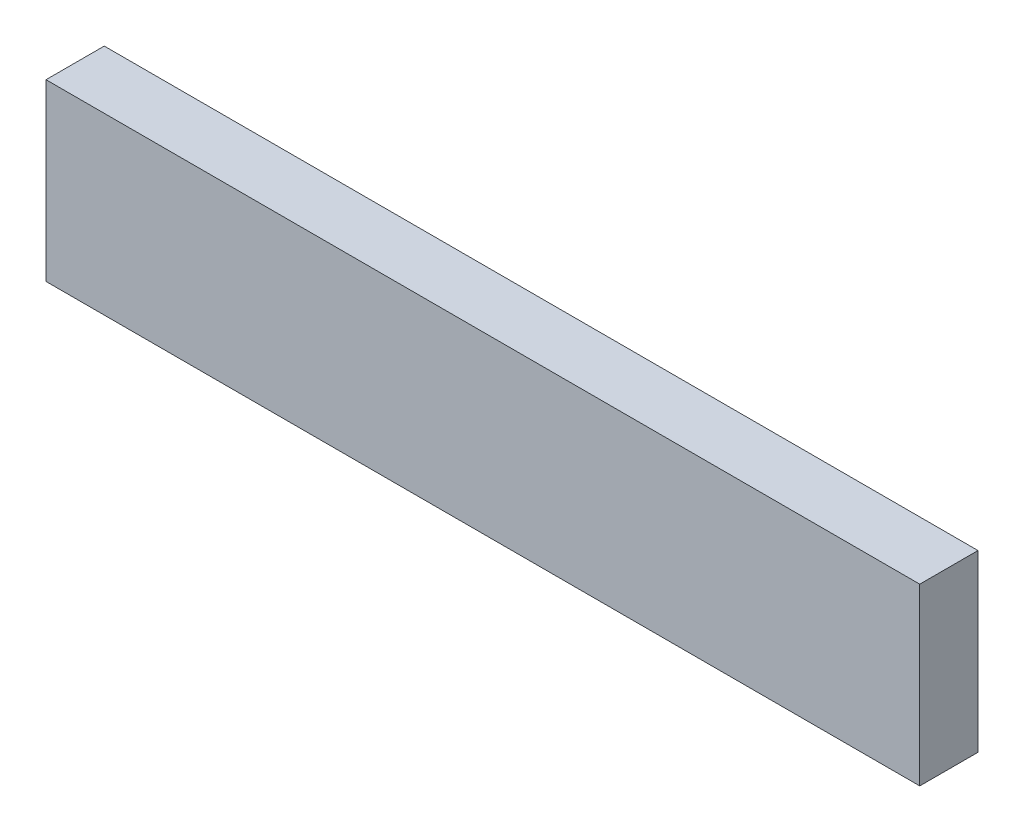
ISO-10303-21;
HEADER;
FILE_DESCRIPTION(('STEP AP214'),'2;1');
FILE_NAME('part.step','',(''),(''),'','','');
FILE_SCHEMA(('AUTOMOTIVE_DESIGN { 1 0 10303 214 1 1 1 1 }'));
ENDSEC;
DATA;
#1=APPLICATION_CONTEXT('core data for automotive mechanical design processes');
#2=APPLICATION_PROTOCOL_DEFINITION('international standard','automotive_design',2000,#1);
#3=PRODUCT_CONTEXT('',#1,'mechanical');
#4=PRODUCT('Part','Part','',(#3));
#5=PRODUCT_RELATED_PRODUCT_CATEGORY('part','',(#4));
#6=PRODUCT_DEFINITION_FORMATION('','',#4);
#7=PRODUCT_DEFINITION_CONTEXT('part definition',#1,'design');
#8=PRODUCT_DEFINITION('design','',#6,#7);
#9=PRODUCT_DEFINITION_SHAPE('','',#8);
#10=(LENGTH_UNIT() NAMED_UNIT(*) SI_UNIT(.MILLI.,.METRE.));
#11=(NAMED_UNIT(*) PLANE_ANGLE_UNIT() SI_UNIT($,.RADIAN.));
#12=(NAMED_UNIT(*) SI_UNIT($,.STERADIAN.) SOLID_ANGLE_UNIT());
#13=UNCERTAINTY_MEASURE_WITH_UNIT(LENGTH_MEASURE(1.E-05),#10,'distance_accuracy_value','');
#14=(GEOMETRIC_REPRESENTATION_CONTEXT(3) GLOBAL_UNCERTAINTY_ASSIGNED_CONTEXT((#13)) GLOBAL_UNIT_ASSIGNED_CONTEXT((#10,
#11,#12)) REPRESENTATION_CONTEXT('',''));
#15=CARTESIAN_POINT('',(0.,0.,0.));
#16=DIRECTION('',(0.,0.,1.));
#17=DIRECTION('',(1.,0.,0.));
#18=AXIS2_PLACEMENT_3D('',#15,#16,#17);
#19=CARTESIAN_POINT('',(22.5,4.5,3.));
#20=DIRECTION('',(-1.,0.,0.));
#21=DIRECTION('',(0.,0.,1.));
#22=AXIS2_PLACEMENT_3D('',#19,#20,#21);
#23=PLANE('',#22);
#24=DIRECTION('',(0.,1.,0.));
#25=VECTOR('',#24,1.);
#26=CARTESIAN_POINT('',(22.5,4.5,0.));
#27=LINE('',#26,#25);
#28=CARTESIAN_POINT('',(22.5,-4.5,0.));
#29=VERTEX_POINT('',#28);
#30=CARTESIAN_POINT('',(22.5,4.5,0.));
#31=VERTEX_POINT('',#30);
#32=EDGE_CURVE('E96',#29,#31,#27,.T.);
#33=ORIENTED_EDGE('',*,*,#32,.T.);
#34=DIRECTION('',(0.,0.,-1.));
#35=VECTOR('',#34,1.);
#36=CARTESIAN_POINT('',(22.5,4.5,3.));
#37=LINE('',#36,#35);
#38=CARTESIAN_POINT('',(22.5,4.5,3.));
#39=VERTEX_POINT('',#38);
#40=EDGE_CURVE('E11',#39,#31,#37,.T.);
#41=ORIENTED_EDGE('',*,*,#40,.F.);
#42=DIRECTION('',(0.,1.,0.));
#43=VECTOR('',#42,1.);
#44=CARTESIAN_POINT('',(22.5,4.5,3.));
#45=LINE('',#44,#43);
#46=CARTESIAN_POINT('',(22.5,-4.5,3.));
#47=VERTEX_POINT('',#46);
#48=EDGE_CURVE('E84',#47,#39,#45,.T.);
#49=ORIENTED_EDGE('',*,*,#48,.F.);
#50=DIRECTION('',(0.,0.,-1.));
#51=VECTOR('',#50,1.);
#52=CARTESIAN_POINT('',(22.5,-4.5,3.));
#53=LINE('',#52,#51);
#54=EDGE_CURVE('E92',#47,#29,#53,.T.);
#55=ORIENTED_EDGE('',*,*,#54,.T.);
#56=EDGE_LOOP('',(#33,#41,#49,#55));
#57=FACE_BOUND('',#56,.T.);
#58=ADVANCED_FACE('F33',(#57),#23,.F.);
#59=CARTESIAN_POINT('',(-22.5,4.5,3.));
#60=DIRECTION('',(0.,-1.,0.));
#61=DIRECTION('',(0.,0.,-1.));
#62=AXIS2_PLACEMENT_3D('',#59,#60,#61);
#63=PLANE('',#62);
#64=DIRECTION('',(-1.,0.,0.));
#65=VECTOR('',#64,1.);
#66=CARTESIAN_POINT('',(-22.5,4.5,0.));
#67=LINE('',#66,#65);
#68=CARTESIAN_POINT('',(-22.5,4.5,0.));
#69=VERTEX_POINT('',#68);
#70=EDGE_CURVE('E88',#31,#69,#67,.T.);
#71=ORIENTED_EDGE('',*,*,#70,.T.);
#72=DIRECTION('',(0.,0.,-1.));
#73=VECTOR('',#72,1.);
#74=CARTESIAN_POINT('',(-22.5,4.5,3.));
#75=LINE('',#74,#73);
#76=CARTESIAN_POINT('',(-22.5,4.5,3.));
#77=VERTEX_POINT('',#76);
#78=EDGE_CURVE('E41',#77,#69,#75,.T.);
#79=ORIENTED_EDGE('',*,*,#78,.F.);
#80=DIRECTION('',(-1.,0.,0.));
#81=VECTOR('',#80,1.);
#82=CARTESIAN_POINT('',(-22.5,4.5,3.));
#83=LINE('',#82,#81);
#84=EDGE_CURVE('E79',#39,#77,#83,.T.);
#85=ORIENTED_EDGE('',*,*,#84,.F.);
#86=ORIENTED_EDGE('',*,*,#40,.T.);
#87=EDGE_LOOP('',(#71,#79,#85,#86));
#88=FACE_BOUND('',#87,.T.);
#89=ADVANCED_FACE('F87',(#88),#63,.F.);
#90=CARTESIAN_POINT('',(-22.5,4.5,3.));
#91=DIRECTION('',(1.,0.,0.));
#92=DIRECTION('',(0.,1.,0.));
#93=AXIS2_PLACEMENT_3D('',#90,#91,#92);
#94=PLANE('',#93);
#95=DIRECTION('',(0.,-1.,0.));
#96=VECTOR('',#95,1.);
#97=CARTESIAN_POINT('',(-22.5,4.5,0.));
#98=LINE('',#97,#96);
#99=CARTESIAN_POINT('',(-22.5,-4.5,0.));
#100=VERTEX_POINT('',#99);
#101=EDGE_CURVE('E66',#69,#100,#98,.T.);
#102=ORIENTED_EDGE('',*,*,#101,.T.);
#103=DIRECTION('',(0.,0.,-1.));
#104=VECTOR('',#103,1.);
#105=CARTESIAN_POINT('',(-22.5,-4.5,3.));
#106=LINE('',#105,#104);
#107=CARTESIAN_POINT('',(-22.5,-4.5,3.));
#108=VERTEX_POINT('',#107);
#109=EDGE_CURVE('E89',#108,#100,#106,.T.);
#110=ORIENTED_EDGE('',*,*,#109,.F.);
#111=DIRECTION('',(0.,-1.,0.));
#112=VECTOR('',#111,1.);
#113=CARTESIAN_POINT('',(-22.5,4.5,3.));
#114=LINE('',#113,#112);
#115=EDGE_CURVE('E82',#77,#108,#114,.T.);
#116=ORIENTED_EDGE('',*,*,#115,.F.);
#117=ORIENTED_EDGE('',*,*,#78,.T.);
#118=EDGE_LOOP('',(#102,#110,#116,#117));
#119=FACE_BOUND('',#118,.T.);
#120=ADVANCED_FACE('F90',(#119),#94,.F.);
#121=CARTESIAN_POINT('',(-22.5,-4.5,3.));
#122=DIRECTION('',(0.,1.,0.));
#123=DIRECTION('',(0.,0.,1.));
#124=AXIS2_PLACEMENT_3D('',#121,#122,#123);
#125=PLANE('',#124);
#126=DIRECTION('',(1.,0.,0.));
#127=VECTOR('',#126,1.);
#128=CARTESIAN_POINT('',(-22.5,-4.5,0.));
#129=LINE('',#128,#127);
#130=EDGE_CURVE('E72',#100,#29,#129,.T.);
#131=ORIENTED_EDGE('',*,*,#130,.T.);
#132=ORIENTED_EDGE('',*,*,#54,.F.);
#133=DIRECTION('',(1.,0.,0.));
#134=VECTOR('',#133,1.);
#135=CARTESIAN_POINT('',(-22.5,-4.5,3.));
#136=LINE('',#135,#134);
#137=EDGE_CURVE('E49',#108,#47,#136,.T.);
#138=ORIENTED_EDGE('',*,*,#137,.F.);
#139=ORIENTED_EDGE('',*,*,#109,.T.);
#140=EDGE_LOOP('',(#131,#132,#138,#139));
#141=FACE_BOUND('',#140,.T.);
#142=ADVANCED_FACE('F103',(#141),#125,.F.);
#143=CARTESIAN_POINT('',(0.,0.,3.));
#144=DIRECTION('',(0.,0.,1.));
#145=DIRECTION('',(1.,0.,0.));
#146=AXIS2_PLACEMENT_3D('',#143,#144,#145);
#147=PLANE('',#146);
#148=ORIENTED_EDGE('',*,*,#48,.T.);
#149=ORIENTED_EDGE('',*,*,#84,.T.);
#150=ORIENTED_EDGE('',*,*,#115,.T.);
#151=ORIENTED_EDGE('',*,*,#137,.T.);
#152=EDGE_LOOP('',(#148,#149,#150,#151));
#153=FACE_BOUND('',#152,.T.);
#154=ADVANCED_FACE('F80',(#153),#147,.T.);
#155=CARTESIAN_POINT('',(0.,0.,0.));
#156=DIRECTION('',(0.,0.,1.));
#157=DIRECTION('',(1.,0.,0.));
#158=AXIS2_PLACEMENT_3D('',#155,#156,#157);
#159=PLANE('',#158);
#160=ORIENTED_EDGE('',*,*,#32,.F.);
#161=ORIENTED_EDGE('',*,*,#130,.F.);
#162=ORIENTED_EDGE('',*,*,#101,.F.);
#163=ORIENTED_EDGE('',*,*,#70,.F.);
#164=EDGE_LOOP('',(#160,#161,#162,#163));
#165=FACE_BOUND('',#164,.T.);
#166=ADVANCED_FACE('F106',(#165),#159,.F.);
#167=CLOSED_SHELL('',(#58,#89,#120,#142,#154,#166));
#168=MANIFOLD_SOLID_BREP('B2',#167);
#169=ADVANCED_BREP_SHAPE_REPRESENTATION('',(#18,#168),#14);
#170=SHAPE_DEFINITION_REPRESENTATION(#9,#169);
ENDSEC;
END-ISO-10303-21;
